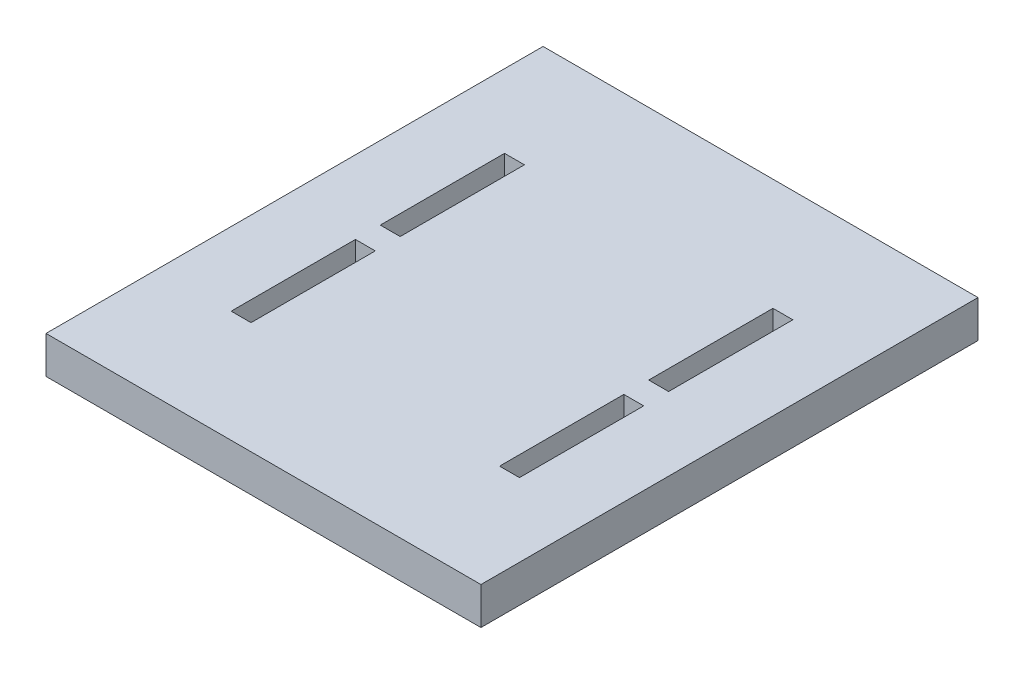
ISO-10303-21;
HEADER;
FILE_DESCRIPTION(('STEP AP214'),'2;1');
FILE_NAME('part.step','',(''),(''),'','','');
FILE_SCHEMA(('AUTOMOTIVE_DESIGN { 1 0 10303 214 1 1 1 1 }'));
ENDSEC;
DATA;
#1=APPLICATION_CONTEXT('core data for automotive mechanical design processes');
#2=APPLICATION_PROTOCOL_DEFINITION('international standard','automotive_design',2000,#1);
#3=PRODUCT_CONTEXT('',#1,'mechanical');
#4=PRODUCT('Part','Part','',(#3));
#5=PRODUCT_RELATED_PRODUCT_CATEGORY('part','',(#4));
#6=PRODUCT_DEFINITION_FORMATION('','',#4);
#7=PRODUCT_DEFINITION_CONTEXT('part definition',#1,'design');
#8=PRODUCT_DEFINITION('design','',#6,#7);
#9=PRODUCT_DEFINITION_SHAPE('','',#8);
#10=(LENGTH_UNIT() NAMED_UNIT(*) SI_UNIT(.MILLI.,.METRE.));
#11=(NAMED_UNIT(*) PLANE_ANGLE_UNIT() SI_UNIT($,.RADIAN.));
#12=(NAMED_UNIT(*) SI_UNIT($,.STERADIAN.) SOLID_ANGLE_UNIT());
#13=UNCERTAINTY_MEASURE_WITH_UNIT(LENGTH_MEASURE(1.E-05),#10,'distance_accuracy_value','');
#14=(GEOMETRIC_REPRESENTATION_CONTEXT(3) GLOBAL_UNCERTAINTY_ASSIGNED_CONTEXT((#13)) GLOBAL_UNIT_ASSIGNED_CONTEXT((#10,
#11,#12)) REPRESENTATION_CONTEXT('',''));
#15=CARTESIAN_POINT('',(0.,0.,0.));
#16=DIRECTION('',(0.,0.,1.));
#17=DIRECTION('',(1.,0.,0.));
#18=AXIS2_PLACEMENT_3D('',#15,#16,#17);
#19=CARTESIAN_POINT('',(0.,6.,42.));
#20=DIRECTION('',(0.,0.,1.));
#21=DIRECTION('',(1.,0.,0.));
#22=AXIS2_PLACEMENT_3D('',#19,#20,#21);
#23=PLANE('',#22);
#24=DIRECTION('',(-1.,0.,0.));
#25=VECTOR('',#24,1.);
#26=CARTESIAN_POINT('',(0.,0.,42.));
#27=LINE('',#26,#25);
#28=CARTESIAN_POINT('',(58.2,0.,42.));
#29=VERTEX_POINT('',#28);
#30=CARTESIAN_POINT('',(55.,0.,42.));
#31=VERTEX_POINT('',#30);
#32=EDGE_CURVE('E289',#29,#31,#27,.T.);
#33=ORIENTED_EDGE('',*,*,#32,.F.);
#34=DIRECTION('',(0.,-1.,0.));
#35=VECTOR('',#34,1.);
#36=CARTESIAN_POINT('',(58.2,6.,42.));
#37=LINE('',#36,#35);
#38=CARTESIAN_POINT('',(58.2,6.,42.));
#39=VERTEX_POINT('',#38);
#40=EDGE_CURVE('E11',#39,#29,#37,.T.);
#41=ORIENTED_EDGE('',*,*,#40,.F.);
#42=DIRECTION('',(-1.,0.,0.));
#43=VECTOR('',#42,1.);
#44=CARTESIAN_POINT('',(0.,6.,42.));
#45=LINE('',#44,#43);
#46=CARTESIAN_POINT('',(55.,6.,42.));
#47=VERTEX_POINT('',#46);
#48=EDGE_CURVE('E215',#39,#47,#45,.T.);
#49=ORIENTED_EDGE('',*,*,#48,.T.);
#50=DIRECTION('',(0.,-1.,0.));
#51=VECTOR('',#50,1.);
#52=CARTESIAN_POINT('',(55.,6.,42.));
#53=LINE('',#52,#51);
#54=EDGE_CURVE('E138',#47,#31,#53,.T.);
#55=ORIENTED_EDGE('',*,*,#54,.T.);
#56=EDGE_LOOP('',(#33,#41,#49,#55));
#57=FACE_BOUND('',#56,.T.);
#58=ADVANCED_FACE('F47',(#57),#23,.T.);
#59=CARTESIAN_POINT('',(58.2,6.,0.));
#60=DIRECTION('',(-1.,0.,0.));
#61=DIRECTION('',(0.,0.,1.));
#62=AXIS2_PLACEMENT_3D('',#59,#60,#61);
#63=PLANE('',#62);
#64=DIRECTION('',(0.,0.,-1.));
#65=VECTOR('',#64,1.);
#66=CARTESIAN_POINT('',(58.2,0.,0.));
#67=LINE('',#66,#65);
#68=CARTESIAN_POINT('',(58.2,0.,62.));
#69=VERTEX_POINT('',#68);
#70=EDGE_CURVE('E203',#69,#29,#67,.T.);
#71=ORIENTED_EDGE('',*,*,#70,.F.);
#72=DIRECTION('',(0.,-1.,0.));
#73=VECTOR('',#72,1.);
#74=CARTESIAN_POINT('',(58.2,6.,62.));
#75=LINE('',#74,#73);
#76=CARTESIAN_POINT('',(58.2,6.,62.));
#77=VERTEX_POINT('',#76);
#78=EDGE_CURVE('E58',#77,#69,#75,.T.);
#79=ORIENTED_EDGE('',*,*,#78,.F.);
#80=DIRECTION('',(0.,0.,-1.));
#81=VECTOR('',#80,1.);
#82=CARTESIAN_POINT('',(58.2,6.,0.));
#83=LINE('',#82,#81);
#84=EDGE_CURVE('E201',#77,#39,#83,.T.);
#85=ORIENTED_EDGE('',*,*,#84,.T.);
#86=ORIENTED_EDGE('',*,*,#40,.T.);
#87=EDGE_LOOP('',(#71,#79,#85,#86));
#88=FACE_BOUND('',#87,.T.);
#89=ADVANCED_FACE('F199',(#88),#63,.T.);
#90=CARTESIAN_POINT('',(0.,6.,62.));
#91=DIRECTION('',(0.,0.,1.));
#92=DIRECTION('',(1.,0.,0.));
#93=AXIS2_PLACEMENT_3D('',#90,#91,#92);
#94=PLANE('',#93);
#95=DIRECTION('',(-1.,0.,0.));
#96=VECTOR('',#95,1.);
#97=CARTESIAN_POINT('',(0.,0.,62.));
#98=LINE('',#97,#96);
#99=CARTESIAN_POINT('',(55.,0.,62.));
#100=VERTEX_POINT('',#99);
#101=EDGE_CURVE('E294',#69,#100,#98,.T.);
#102=ORIENTED_EDGE('',*,*,#101,.T.);
#103=DIRECTION('',(0.,-1.,0.));
#104=VECTOR('',#103,1.);
#105=CARTESIAN_POINT('',(55.,6.,62.));
#106=LINE('',#105,#104);
#107=CARTESIAN_POINT('',(55.,6.,62.));
#108=VERTEX_POINT('',#107);
#109=EDGE_CURVE('E207',#108,#100,#106,.T.);
#110=ORIENTED_EDGE('',*,*,#109,.F.);
#111=DIRECTION('',(-1.,0.,0.));
#112=VECTOR('',#111,1.);
#113=CARTESIAN_POINT('',(0.,6.,62.));
#114=LINE('',#113,#112);
#115=EDGE_CURVE('E210',#77,#108,#114,.T.);
#116=ORIENTED_EDGE('',*,*,#115,.F.);
#117=ORIENTED_EDGE('',*,*,#78,.T.);
#118=EDGE_LOOP('',(#102,#110,#116,#117));
#119=FACE_BOUND('',#118,.T.);
#120=ADVANCED_FACE('F211',(#119),#94,.F.);
#121=CARTESIAN_POINT('',(0.,6.,62.));
#122=DIRECTION('',(0.,0.,-1.));
#123=DIRECTION('',(-1.,0.,0.));
#124=AXIS2_PLACEMENT_3D('',#121,#122,#123);
#125=PLANE('',#124);
#126=DIRECTION('',(1.,0.,0.));
#127=VECTOR('',#126,1.);
#128=CARTESIAN_POINT('',(0.,0.,62.));
#129=LINE('',#128,#127);
#130=CARTESIAN_POINT('',(11.8,0.,62.));
#131=VERTEX_POINT('',#130);
#132=CARTESIAN_POINT('',(15.,0.,62.));
#133=VERTEX_POINT('',#132);
#134=EDGE_CURVE('E273',#131,#133,#129,.T.);
#135=ORIENTED_EDGE('',*,*,#134,.F.);
#136=DIRECTION('',(0.,-1.,0.));
#137=VECTOR('',#136,1.);
#138=CARTESIAN_POINT('',(11.8,6.,62.));
#139=LINE('',#138,#137);
#140=CARTESIAN_POINT('',(11.8,6.,62.));
#141=VERTEX_POINT('',#140);
#142=EDGE_CURVE('E301',#141,#131,#139,.T.);
#143=ORIENTED_EDGE('',*,*,#142,.F.);
#144=DIRECTION('',(1.,0.,0.));
#145=VECTOR('',#144,1.);
#146=CARTESIAN_POINT('',(0.,6.,62.));
#147=LINE('',#146,#145);
#148=CARTESIAN_POINT('',(15.,6.,62.));
#149=VERTEX_POINT('',#148);
#150=EDGE_CURVE('E411',#141,#149,#147,.T.);
#151=ORIENTED_EDGE('',*,*,#150,.T.);
#152=DIRECTION('',(0.,-1.,0.));
#153=VECTOR('',#152,1.);
#154=CARTESIAN_POINT('',(15.,6.,62.));
#155=LINE('',#154,#153);
#156=EDGE_CURVE('E304',#149,#133,#155,.T.);
#157=ORIENTED_EDGE('',*,*,#156,.T.);
#158=EDGE_LOOP('',(#135,#143,#151,#157));
#159=FACE_BOUND('',#158,.T.);
#160=ADVANCED_FACE('F438',(#159),#125,.T.);
#161=CARTESIAN_POINT('',(11.8,6.,0.));
#162=DIRECTION('',(-1.,0.,0.));
#163=DIRECTION('',(0.,0.,1.));
#164=AXIS2_PLACEMENT_3D('',#161,#162,#163);
#165=PLANE('',#164);
#166=DIRECTION('',(0.,0.,-1.));
#167=VECTOR('',#166,1.);
#168=CARTESIAN_POINT('',(11.8,0.,0.));
#169=LINE('',#168,#167);
#170=CARTESIAN_POINT('',(11.8,0.,42.));
#171=VERTEX_POINT('',#170);
#172=EDGE_CURVE('E277',#131,#171,#169,.T.);
#173=ORIENTED_EDGE('',*,*,#172,.T.);
#174=DIRECTION('',(0.,-1.,0.));
#175=VECTOR('',#174,1.);
#176=CARTESIAN_POINT('',(11.8,6.,42.));
#177=LINE('',#176,#175);
#178=CARTESIAN_POINT('',(11.8,6.,42.));
#179=VERTEX_POINT('',#178);
#180=EDGE_CURVE('E311',#179,#171,#177,.T.);
#181=ORIENTED_EDGE('',*,*,#180,.F.);
#182=DIRECTION('',(0.,0.,-1.));
#183=VECTOR('',#182,1.);
#184=CARTESIAN_POINT('',(11.8,6.,0.));
#185=LINE('',#184,#183);
#186=EDGE_CURVE('E415',#141,#179,#185,.T.);
#187=ORIENTED_EDGE('',*,*,#186,.F.);
#188=ORIENTED_EDGE('',*,*,#142,.T.);
#189=EDGE_LOOP('',(#173,#181,#187,#188));
#190=FACE_BOUND('',#189,.T.);
#191=ADVANCED_FACE('F440',(#190),#165,.F.);
#192=CARTESIAN_POINT('',(0.,6.,42.));
#193=DIRECTION('',(0.,0.,-1.));
#194=DIRECTION('',(-1.,0.,0.));
#195=AXIS2_PLACEMENT_3D('',#192,#193,#194);
#196=PLANE('',#195);
#197=DIRECTION('',(1.,0.,0.));
#198=VECTOR('',#197,1.);
#199=CARTESIAN_POINT('',(0.,0.,42.));
#200=LINE('',#199,#198);
#201=CARTESIAN_POINT('',(15.,0.,42.));
#202=VERTEX_POINT('',#201);
#203=EDGE_CURVE('E281',#171,#202,#200,.T.);
#204=ORIENTED_EDGE('',*,*,#203,.T.);
#205=DIRECTION('',(0.,-1.,0.));
#206=VECTOR('',#205,1.);
#207=CARTESIAN_POINT('',(15.,6.,42.));
#208=LINE('',#207,#206);
#209=CARTESIAN_POINT('',(15.,6.,42.));
#210=VERTEX_POINT('',#209);
#211=EDGE_CURVE('E307',#210,#202,#208,.T.);
#212=ORIENTED_EDGE('',*,*,#211,.F.);
#213=DIRECTION('',(1.,0.,0.));
#214=VECTOR('',#213,1.);
#215=CARTESIAN_POINT('',(0.,6.,42.));
#216=LINE('',#215,#214);
#217=EDGE_CURVE('E419',#179,#210,#216,.T.);
#218=ORIENTED_EDGE('',*,*,#217,.F.);
#219=ORIENTED_EDGE('',*,*,#180,.T.);
#220=EDGE_LOOP('',(#204,#212,#218,#219));
#221=FACE_BOUND('',#220,.T.);
#222=ADVANCED_FACE('F433',(#221),#196,.F.);
#223=CARTESIAN_POINT('',(0.,6.,18.));
#224=DIRECTION('',(0.,0.,1.));
#225=DIRECTION('',(1.,0.,0.));
#226=AXIS2_PLACEMENT_3D('',#223,#224,#225);
#227=PLANE('',#226);
#228=DIRECTION('',(-1.,0.,0.));
#229=VECTOR('',#228,1.);
#230=CARTESIAN_POINT('',(0.,0.,18.));
#231=LINE('',#230,#229);
#232=CARTESIAN_POINT('',(58.2,0.,18.));
#233=VERTEX_POINT('',#232);
#234=CARTESIAN_POINT('',(55.,0.,18.));
#235=VERTEX_POINT('',#234);
#236=EDGE_CURVE('E257',#233,#235,#231,.T.);
#237=ORIENTED_EDGE('',*,*,#236,.F.);
#238=DIRECTION('',(0.,-1.,0.));
#239=VECTOR('',#238,1.);
#240=CARTESIAN_POINT('',(58.2,6.,18.));
#241=LINE('',#240,#239);
#242=CARTESIAN_POINT('',(58.2,6.,18.));
#243=VERTEX_POINT('',#242);
#244=EDGE_CURVE('E308',#243,#233,#241,.T.);
#245=ORIENTED_EDGE('',*,*,#244,.F.);
#246=DIRECTION('',(-1.,0.,0.));
#247=VECTOR('',#246,1.);
#248=CARTESIAN_POINT('',(0.,6.,18.));
#249=LINE('',#248,#247);
#250=CARTESIAN_POINT('',(55.,6.,18.));
#251=VERTEX_POINT('',#250);
#252=EDGE_CURVE('E396',#243,#251,#249,.T.);
#253=ORIENTED_EDGE('',*,*,#252,.T.);
#254=DIRECTION('',(0.,-1.,0.));
#255=VECTOR('',#254,1.);
#256=CARTESIAN_POINT('',(55.,6.,18.));
#257=LINE('',#256,#255);
#258=EDGE_CURVE('E317',#251,#235,#257,.T.);
#259=ORIENTED_EDGE('',*,*,#258,.T.);
#260=EDGE_LOOP('',(#237,#245,#253,#259));
#261=FACE_BOUND('',#260,.T.);
#262=ADVANCED_FACE('F447',(#261),#227,.T.);
#263=CARTESIAN_POINT('',(58.2,6.,0.));
#264=DIRECTION('',(1.,0.,0.));
#265=DIRECTION('',(0.,0.,-1.));
#266=AXIS2_PLACEMENT_3D('',#263,#264,#265);
#267=PLANE('',#266);
#268=DIRECTION('',(0.,0.,1.));
#269=VECTOR('',#268,1.);
#270=CARTESIAN_POINT('',(58.2,0.,0.));
#271=LINE('',#270,#269);
#272=CARTESIAN_POINT('',(58.2,0.,38.));
#273=VERTEX_POINT('',#272);
#274=EDGE_CURVE('E261',#233,#273,#271,.T.);
#275=ORIENTED_EDGE('',*,*,#274,.T.);
#276=DIRECTION('',(0.,-1.,0.));
#277=VECTOR('',#276,1.);
#278=CARTESIAN_POINT('',(58.2,6.,38.));
#279=LINE('',#278,#277);
#280=CARTESIAN_POINT('',(58.2,6.,38.));
#281=VERTEX_POINT('',#280);
#282=EDGE_CURVE('E324',#281,#273,#279,.T.);
#283=ORIENTED_EDGE('',*,*,#282,.F.);
#284=DIRECTION('',(0.,0.,1.));
#285=VECTOR('',#284,1.);
#286=CARTESIAN_POINT('',(58.2,6.,0.));
#287=LINE('',#286,#285);
#288=EDGE_CURVE('E400',#243,#281,#287,.T.);
#289=ORIENTED_EDGE('',*,*,#288,.F.);
#290=ORIENTED_EDGE('',*,*,#244,.T.);
#291=EDGE_LOOP('',(#275,#283,#289,#290));
#292=FACE_BOUND('',#291,.T.);
#293=ADVANCED_FACE('F493',(#292),#267,.F.);
#294=CARTESIAN_POINT('',(0.,6.,38.));
#295=DIRECTION('',(0.,0.,1.));
#296=DIRECTION('',(1.,0.,0.));
#297=AXIS2_PLACEMENT_3D('',#294,#295,#296);
#298=PLANE('',#297);
#299=DIRECTION('',(-1.,0.,0.));
#300=VECTOR('',#299,1.);
#301=CARTESIAN_POINT('',(0.,0.,38.));
#302=LINE('',#301,#300);
#303=CARTESIAN_POINT('',(55.,0.,38.));
#304=VERTEX_POINT('',#303);
#305=EDGE_CURVE('E265',#273,#304,#302,.T.);
#306=ORIENTED_EDGE('',*,*,#305,.T.);
#307=DIRECTION('',(0.,-1.,0.));
#308=VECTOR('',#307,1.);
#309=CARTESIAN_POINT('',(55.,6.,38.));
#310=LINE('',#309,#308);
#311=CARTESIAN_POINT('',(55.,6.,38.));
#312=VERTEX_POINT('',#311);
#313=EDGE_CURVE('E320',#312,#304,#310,.T.);
#314=ORIENTED_EDGE('',*,*,#313,.F.);
#315=DIRECTION('',(-1.,0.,0.));
#316=VECTOR('',#315,1.);
#317=CARTESIAN_POINT('',(0.,6.,38.));
#318=LINE('',#317,#316);
#319=EDGE_CURVE('E404',#281,#312,#318,.T.);
#320=ORIENTED_EDGE('',*,*,#319,.F.);
#321=ORIENTED_EDGE('',*,*,#282,.T.);
#322=EDGE_LOOP('',(#306,#314,#320,#321));
#323=FACE_BOUND('',#322,.T.);
#324=ADVANCED_FACE('F479',(#323),#298,.F.);
#325=CARTESIAN_POINT('',(0.,6.,18.));
#326=DIRECTION('',(0.,0.,-1.));
#327=DIRECTION('',(-1.,0.,0.));
#328=AXIS2_PLACEMENT_3D('',#325,#326,#327);
#329=PLANE('',#328);
#330=DIRECTION('',(1.,0.,0.));
#331=VECTOR('',#330,1.);
#332=CARTESIAN_POINT('',(0.,0.,18.));
#333=LINE('',#332,#331);
#334=CARTESIAN_POINT('',(11.8,0.,18.));
#335=VERTEX_POINT('',#334);
#336=CARTESIAN_POINT('',(15.,0.,18.));
#337=VERTEX_POINT('',#336);
#338=EDGE_CURVE('E241',#335,#337,#333,.T.);
#339=ORIENTED_EDGE('',*,*,#338,.T.);
#340=DIRECTION('',(0.,-1.,0.));
#341=VECTOR('',#340,1.);
#342=CARTESIAN_POINT('',(15.,6.,18.));
#343=LINE('',#342,#341);
#344=CARTESIAN_POINT('',(15.,6.,18.));
#345=VERTEX_POINT('',#344);
#346=EDGE_CURVE('E321',#345,#337,#343,.T.);
#347=ORIENTED_EDGE('',*,*,#346,.F.);
#348=DIRECTION('',(1.,0.,0.));
#349=VECTOR('',#348,1.);
#350=CARTESIAN_POINT('',(0.,6.,18.));
#351=LINE('',#350,#349);
#352=CARTESIAN_POINT('',(11.8,6.,18.));
#353=VERTEX_POINT('',#352);
#354=EDGE_CURVE('E373',#353,#345,#351,.T.);
#355=ORIENTED_EDGE('',*,*,#354,.F.);
#356=DIRECTION('',(0.,-1.,0.));
#357=VECTOR('',#356,1.);
#358=CARTESIAN_POINT('',(11.8,6.,18.));
#359=LINE('',#358,#357);
#360=EDGE_CURVE('E330',#353,#335,#359,.T.);
#361=ORIENTED_EDGE('',*,*,#360,.T.);
#362=EDGE_LOOP('',(#339,#347,#355,#361));
#363=FACE_BOUND('',#362,.T.);
#364=ADVANCED_FACE('F475',(#363),#329,.F.);
#365=CARTESIAN_POINT('',(15.,6.,0.));
#366=DIRECTION('',(1.,0.,0.));
#367=DIRECTION('',(0.,0.,-1.));
#368=AXIS2_PLACEMENT_3D('',#365,#366,#367);
#369=PLANE('',#368);
#370=DIRECTION('',(0.,0.,1.));
#371=VECTOR('',#370,1.);
#372=CARTESIAN_POINT('',(15.,0.,0.));
#373=LINE('',#372,#371);
#374=CARTESIAN_POINT('',(15.,0.,38.));
#375=VERTEX_POINT('',#374);
#376=EDGE_CURVE('E245',#337,#375,#373,.T.);
#377=ORIENTED_EDGE('',*,*,#376,.T.);
#378=DIRECTION('',(0.,-1.,0.));
#379=VECTOR('',#378,1.);
#380=CARTESIAN_POINT('',(15.,6.,38.));
#381=LINE('',#380,#379);
#382=CARTESIAN_POINT('',(15.,6.,38.));
#383=VERTEX_POINT('',#382);
#384=EDGE_CURVE('E336',#383,#375,#381,.T.);
#385=ORIENTED_EDGE('',*,*,#384,.F.);
#386=DIRECTION('',(0.,0.,1.));
#387=VECTOR('',#386,1.);
#388=CARTESIAN_POINT('',(15.,6.,0.));
#389=LINE('',#388,#387);
#390=EDGE_CURVE('E385',#345,#383,#389,.T.);
#391=ORIENTED_EDGE('',*,*,#390,.F.);
#392=ORIENTED_EDGE('',*,*,#346,.T.);
#393=EDGE_LOOP('',(#377,#385,#391,#392));
#394=FACE_BOUND('',#393,.T.);
#395=ADVANCED_FACE('F478',(#394),#369,.F.);
#396=CARTESIAN_POINT('',(0.,6.,38.));
#397=DIRECTION('',(0.,0.,-1.));
#398=DIRECTION('',(-1.,0.,0.));
#399=AXIS2_PLACEMENT_3D('',#396,#397,#398);
#400=PLANE('',#399);
#401=DIRECTION('',(1.,0.,0.));
#402=VECTOR('',#401,1.);
#403=CARTESIAN_POINT('',(0.,0.,38.));
#404=LINE('',#403,#402);
#405=CARTESIAN_POINT('',(11.8,0.,38.));
#406=VERTEX_POINT('',#405);
#407=EDGE_CURVE('E249',#406,#375,#404,.T.);
#408=ORIENTED_EDGE('',*,*,#407,.F.);
#409=DIRECTION('',(0.,-1.,0.));
#410=VECTOR('',#409,1.);
#411=CARTESIAN_POINT('',(11.8,6.,38.));
#412=LINE('',#411,#410);
#413=CARTESIAN_POINT('',(11.8,6.,38.));
#414=VERTEX_POINT('',#413);
#415=EDGE_CURVE('E333',#414,#406,#412,.T.);
#416=ORIENTED_EDGE('',*,*,#415,.F.);
#417=DIRECTION('',(1.,0.,0.));
#418=VECTOR('',#417,1.);
#419=CARTESIAN_POINT('',(0.,6.,38.));
#420=LINE('',#419,#418);
#421=EDGE_CURVE('E388',#414,#383,#420,.T.);
#422=ORIENTED_EDGE('',*,*,#421,.T.);
#423=ORIENTED_EDGE('',*,*,#384,.T.);
#424=EDGE_LOOP('',(#408,#416,#422,#423));
#425=FACE_BOUND('',#424,.T.);
#426=ADVANCED_FACE('F483',(#425),#400,.T.);
#427=CARTESIAN_POINT('',(0.,6.,80.));
#428=DIRECTION('',(0.,0.,-1.));
#429=DIRECTION('',(-1.,0.,0.));
#430=AXIS2_PLACEMENT_3D('',#427,#428,#429);
#431=PLANE('',#430);
#432=DIRECTION('',(1.,0.,0.));
#433=VECTOR('',#432,1.);
#434=CARTESIAN_POINT('',(0.,0.,80.));
#435=LINE('',#434,#433);
#436=CARTESIAN_POINT('',(0.,0.,80.));
#437=VERTEX_POINT('',#436);
#438=CARTESIAN_POINT('',(70.,0.,80.));
#439=VERTEX_POINT('',#438);
#440=EDGE_CURVE('E226',#437,#439,#435,.T.);
#441=ORIENTED_EDGE('',*,*,#440,.T.);
#442=DIRECTION('',(0.,-1.,0.));
#443=VECTOR('',#442,1.);
#444=CARTESIAN_POINT('',(70.,6.,80.));
#445=LINE('',#444,#443);
#446=CARTESIAN_POINT('',(70.,6.,80.));
#447=VERTEX_POINT('',#446);
#448=EDGE_CURVE('E51',#447,#439,#445,.T.);
#449=ORIENTED_EDGE('',*,*,#448,.F.);
#450=DIRECTION('',(1.,0.,0.));
#451=VECTOR('',#450,1.);
#452=CARTESIAN_POINT('',(0.,6.,80.));
#453=LINE('',#452,#451);
#454=CARTESIAN_POINT('',(0.,6.,80.));
#455=VERTEX_POINT('',#454);
#456=EDGE_CURVE('E146',#455,#447,#453,.T.);
#457=ORIENTED_EDGE('',*,*,#456,.F.);
#458=DIRECTION('',(0.,-1.,0.));
#459=VECTOR('',#458,1.);
#460=CARTESIAN_POINT('',(0.,6.,80.));
#461=LINE('',#460,#459);
#462=EDGE_CURVE('E225',#455,#437,#461,.T.);
#463=ORIENTED_EDGE('',*,*,#462,.T.);
#464=EDGE_LOOP('',(#441,#449,#457,#463));
#465=FACE_BOUND('',#464,.T.);
#466=ADVANCED_FACE('F49',(#465),#431,.F.);
#467=CARTESIAN_POINT('',(70.,6.,0.));
#468=DIRECTION('',(1.,0.,0.));
#469=DIRECTION('',(0.,0.,-1.));
#470=AXIS2_PLACEMENT_3D('',#467,#468,#469);
#471=PLANE('',#470);
#472=DIRECTION('',(0.,0.,1.));
#473=VECTOR('',#472,1.);
#474=CARTESIAN_POINT('',(70.,0.,0.));
#475=LINE('',#474,#473);
#476=CARTESIAN_POINT('',(70.,0.,0.));
#477=VERTEX_POINT('',#476);
#478=EDGE_CURVE('E230',#477,#439,#475,.T.);
#479=ORIENTED_EDGE('',*,*,#478,.F.);
#480=DIRECTION('',(0.,-1.,0.));
#481=VECTOR('',#480,1.);
#482=CARTESIAN_POINT('',(70.,6.,0.));
#483=LINE('',#482,#481);
#484=CARTESIAN_POINT('',(70.,6.,0.));
#485=VERTEX_POINT('',#484);
#486=EDGE_CURVE('E347',#485,#477,#483,.T.);
#487=ORIENTED_EDGE('',*,*,#486,.F.);
#488=DIRECTION('',(0.,0.,1.));
#489=VECTOR('',#488,1.);
#490=CARTESIAN_POINT('',(70.,6.,0.));
#491=LINE('',#490,#489);
#492=EDGE_CURVE('E357',#485,#447,#491,.T.);
#493=ORIENTED_EDGE('',*,*,#492,.T.);
#494=ORIENTED_EDGE('',*,*,#448,.T.);
#495=EDGE_LOOP('',(#479,#487,#493,#494));
#496=FACE_BOUND('',#495,.T.);
#497=ADVANCED_FACE('F356',(#496),#471,.T.);
#498=CARTESIAN_POINT('',(0.,6.,0.));
#499=DIRECTION('',(0.,0.,-1.));
#500=DIRECTION('',(-1.,0.,0.));
#501=AXIS2_PLACEMENT_3D('',#498,#499,#500);
#502=PLANE('',#501);
#503=DIRECTION('',(1.,0.,0.));
#504=VECTOR('',#503,1.);
#505=CARTESIAN_POINT('',(0.,0.,0.));
#506=LINE('',#505,#504);
#507=CARTESIAN_POINT('',(0.,0.,0.));
#508=VERTEX_POINT('',#507);
#509=EDGE_CURVE('E234',#508,#477,#506,.T.);
#510=ORIENTED_EDGE('',*,*,#509,.F.);
#511=DIRECTION('',(0.,-1.,0.));
#512=VECTOR('',#511,1.);
#513=CARTESIAN_POINT('',(0.,6.,0.));
#514=LINE('',#513,#512);
#515=CARTESIAN_POINT('',(0.,6.,0.));
#516=VERTEX_POINT('',#515);
#517=EDGE_CURVE('E345',#516,#508,#514,.T.);
#518=ORIENTED_EDGE('',*,*,#517,.F.);
#519=DIRECTION('',(1.,0.,0.));
#520=VECTOR('',#519,1.);
#521=CARTESIAN_POINT('',(0.,6.,0.));
#522=LINE('',#521,#520);
#523=EDGE_CURVE('E368',#516,#485,#522,.T.);
#524=ORIENTED_EDGE('',*,*,#523,.T.);
#525=ORIENTED_EDGE('',*,*,#486,.T.);
#526=EDGE_LOOP('',(#510,#518,#524,#525));
#527=FACE_BOUND('',#526,.T.);
#528=ADVANCED_FACE('F365',(#527),#502,.T.);
#529=CARTESIAN_POINT('',(15.,6.,0.));
#530=DIRECTION('',(-1.,0.,0.));
#531=DIRECTION('',(0.,0.,1.));
#532=AXIS2_PLACEMENT_3D('',#529,#530,#531);
#533=PLANE('',#532);
#534=DIRECTION('',(0.,0.,-1.));
#535=VECTOR('',#534,1.);
#536=CARTESIAN_POINT('',(15.,0.,0.));
#537=LINE('',#536,#535);
#538=EDGE_CURVE('E285',#133,#202,#537,.T.);
#539=ORIENTED_EDGE('',*,*,#538,.F.);
#540=ORIENTED_EDGE('',*,*,#156,.F.);
#541=DIRECTION('',(0.,0.,-1.));
#542=VECTOR('',#541,1.);
#543=CARTESIAN_POINT('',(15.,6.,0.));
#544=LINE('',#543,#542);
#545=EDGE_CURVE('E219',#149,#210,#544,.T.);
#546=ORIENTED_EDGE('',*,*,#545,.T.);
#547=ORIENTED_EDGE('',*,*,#211,.T.);
#548=EDGE_LOOP('',(#539,#540,#546,#547));
#549=FACE_BOUND('',#548,.T.);
#550=ADVANCED_FACE('F426',(#549),#533,.T.);
#551=CARTESIAN_POINT('',(55.,6.,0.));
#552=DIRECTION('',(1.,0.,0.));
#553=DIRECTION('',(0.,0.,-1.));
#554=AXIS2_PLACEMENT_3D('',#551,#552,#553);
#555=PLANE('',#554);
#556=DIRECTION('',(0.,0.,1.));
#557=VECTOR('',#556,1.);
#558=CARTESIAN_POINT('',(55.,0.,0.));
#559=LINE('',#558,#557);
#560=EDGE_CURVE('E269',#235,#304,#559,.T.);
#561=ORIENTED_EDGE('',*,*,#560,.F.);
#562=ORIENTED_EDGE('',*,*,#258,.F.);
#563=DIRECTION('',(0.,0.,1.));
#564=VECTOR('',#563,1.);
#565=CARTESIAN_POINT('',(55.,6.,0.));
#566=LINE('',#565,#564);
#567=EDGE_CURVE('E407',#251,#312,#566,.T.);
#568=ORIENTED_EDGE('',*,*,#567,.T.);
#569=ORIENTED_EDGE('',*,*,#313,.T.);
#570=EDGE_LOOP('',(#561,#562,#568,#569));
#571=FACE_BOUND('',#570,.T.);
#572=ADVANCED_FACE('F459',(#571),#555,.T.);
#573=CARTESIAN_POINT('',(11.8,6.,0.));
#574=DIRECTION('',(1.,0.,0.));
#575=DIRECTION('',(0.,0.,-1.));
#576=AXIS2_PLACEMENT_3D('',#573,#574,#575);
#577=PLANE('',#576);
#578=DIRECTION('',(0.,0.,1.));
#579=VECTOR('',#578,1.);
#580=CARTESIAN_POINT('',(11.8,0.,0.));
#581=LINE('',#580,#579);
#582=EDGE_CURVE('E253',#335,#406,#581,.T.);
#583=ORIENTED_EDGE('',*,*,#582,.F.);
#584=ORIENTED_EDGE('',*,*,#360,.F.);
#585=DIRECTION('',(0.,0.,1.));
#586=VECTOR('',#585,1.);
#587=CARTESIAN_POINT('',(11.8,6.,0.));
#588=LINE('',#587,#586);
#589=EDGE_CURVE('E392',#353,#414,#588,.T.);
#590=ORIENTED_EDGE('',*,*,#589,.T.);
#591=ORIENTED_EDGE('',*,*,#415,.T.);
#592=EDGE_LOOP('',(#583,#584,#590,#591));
#593=FACE_BOUND('',#592,.T.);
#594=ADVANCED_FACE('F464',(#593),#577,.T.);
#595=CARTESIAN_POINT('',(0.,6.,0.));
#596=DIRECTION('',(1.,0.,0.));
#597=DIRECTION('',(0.,0.,-1.));
#598=AXIS2_PLACEMENT_3D('',#595,#596,#597);
#599=PLANE('',#598);
#600=DIRECTION('',(0.,0.,1.));
#601=VECTOR('',#600,1.);
#602=CARTESIAN_POINT('',(0.,0.,0.));
#603=LINE('',#602,#601);
#604=EDGE_CURVE('E238',#508,#437,#603,.T.);
#605=ORIENTED_EDGE('',*,*,#604,.T.);
#606=ORIENTED_EDGE('',*,*,#462,.F.);
#607=DIRECTION('',(0.,0.,1.));
#608=VECTOR('',#607,1.);
#609=CARTESIAN_POINT('',(0.,6.,0.));
#610=LINE('',#609,#608);
#611=EDGE_CURVE('E370',#516,#455,#610,.T.);
#612=ORIENTED_EDGE('',*,*,#611,.F.);
#613=ORIENTED_EDGE('',*,*,#517,.T.);
#614=EDGE_LOOP('',(#605,#606,#612,#613));
#615=FACE_BOUND('',#614,.T.);
#616=ADVANCED_FACE('F371',(#615),#599,.F.);
#617=CARTESIAN_POINT('',(55.,6.,0.));
#618=DIRECTION('',(-1.,0.,0.));
#619=DIRECTION('',(0.,0.,1.));
#620=AXIS2_PLACEMENT_3D('',#617,#618,#619);
#621=PLANE('',#620);
#622=DIRECTION('',(0.,0.,-1.));
#623=VECTOR('',#622,1.);
#624=CARTESIAN_POINT('',(55.,0.,0.));
#625=LINE('',#624,#623);
#626=EDGE_CURVE('E131',#100,#31,#625,.T.);
#627=ORIENTED_EDGE('',*,*,#626,.T.);
#628=ORIENTED_EDGE('',*,*,#54,.F.);
#629=DIRECTION('',(0.,0.,-1.));
#630=VECTOR('',#629,1.);
#631=CARTESIAN_POINT('',(55.,6.,0.));
#632=LINE('',#631,#630);
#633=EDGE_CURVE('E67',#108,#47,#632,.T.);
#634=ORIENTED_EDGE('',*,*,#633,.F.);
#635=ORIENTED_EDGE('',*,*,#109,.T.);
#636=EDGE_LOOP('',(#627,#628,#634,#635));
#637=FACE_BOUND('',#636,.T.);
#638=ADVANCED_FACE('F474',(#637),#621,.F.);
#639=CARTESIAN_POINT('',(0.,6.,0.));
#640=DIRECTION('',(0.,1.,0.));
#641=DIRECTION('',(0.,0.,1.));
#642=AXIS2_PLACEMENT_3D('',#639,#640,#641);
#643=PLANE('',#642);
#644=ORIENTED_EDGE('',*,*,#456,.T.);
#645=ORIENTED_EDGE('',*,*,#492,.F.);
#646=ORIENTED_EDGE('',*,*,#523,.F.);
#647=ORIENTED_EDGE('',*,*,#611,.T.);
#648=EDGE_LOOP('',(#644,#645,#646,#647));
#649=FACE_BOUND('',#648,.T.);
#650=ORIENTED_EDGE('',*,*,#354,.T.);
#651=ORIENTED_EDGE('',*,*,#390,.T.);
#652=ORIENTED_EDGE('',*,*,#421,.F.);
#653=ORIENTED_EDGE('',*,*,#589,.F.);
#654=EDGE_LOOP('',(#650,#651,#652,#653));
#655=FACE_BOUND('',#654,.T.);
#656=ORIENTED_EDGE('',*,*,#252,.F.);
#657=ORIENTED_EDGE('',*,*,#288,.T.);
#658=ORIENTED_EDGE('',*,*,#319,.T.);
#659=ORIENTED_EDGE('',*,*,#567,.F.);
#660=EDGE_LOOP('',(#656,#657,#658,#659));
#661=FACE_BOUND('',#660,.T.);
#662=ORIENTED_EDGE('',*,*,#150,.F.);
#663=ORIENTED_EDGE('',*,*,#186,.T.);
#664=ORIENTED_EDGE('',*,*,#217,.T.);
#665=ORIENTED_EDGE('',*,*,#545,.F.);
#666=EDGE_LOOP('',(#662,#663,#664,#665));
#667=FACE_BOUND('',#666,.T.);
#668=ORIENTED_EDGE('',*,*,#48,.F.);
#669=ORIENTED_EDGE('',*,*,#84,.F.);
#670=ORIENTED_EDGE('',*,*,#115,.T.);
#671=ORIENTED_EDGE('',*,*,#633,.T.);
#672=EDGE_LOOP('',(#668,#669,#670,#671));
#673=FACE_BOUND('',#672,.T.);
#674=ADVANCED_FACE('F214',(#649,#655,#661,#667,#673),#643,.T.);
#675=CARTESIAN_POINT('',(0.,0.,0.));
#676=DIRECTION('',(0.,1.,0.));
#677=DIRECTION('',(0.,0.,1.));
#678=AXIS2_PLACEMENT_3D('',#675,#676,#677);
#679=PLANE('',#678);
#680=ORIENTED_EDGE('',*,*,#440,.F.);
#681=ORIENTED_EDGE('',*,*,#604,.F.);
#682=ORIENTED_EDGE('',*,*,#509,.T.);
#683=ORIENTED_EDGE('',*,*,#478,.T.);
#684=EDGE_LOOP('',(#680,#681,#682,#683));
#685=FACE_BOUND('',#684,.T.);
#686=ORIENTED_EDGE('',*,*,#338,.F.);
#687=ORIENTED_EDGE('',*,*,#582,.T.);
#688=ORIENTED_EDGE('',*,*,#407,.T.);
#689=ORIENTED_EDGE('',*,*,#376,.F.);
#690=EDGE_LOOP('',(#686,#687,#688,#689));
#691=FACE_BOUND('',#690,.T.);
#692=ORIENTED_EDGE('',*,*,#236,.T.);
#693=ORIENTED_EDGE('',*,*,#560,.T.);
#694=ORIENTED_EDGE('',*,*,#305,.F.);
#695=ORIENTED_EDGE('',*,*,#274,.F.);
#696=EDGE_LOOP('',(#692,#693,#694,#695));
#697=FACE_BOUND('',#696,.T.);
#698=ORIENTED_EDGE('',*,*,#134,.T.);
#699=ORIENTED_EDGE('',*,*,#538,.T.);
#700=ORIENTED_EDGE('',*,*,#203,.F.);
#701=ORIENTED_EDGE('',*,*,#172,.F.);
#702=EDGE_LOOP('',(#698,#699,#700,#701));
#703=FACE_BOUND('',#702,.T.);
#704=ORIENTED_EDGE('',*,*,#32,.T.);
#705=ORIENTED_EDGE('',*,*,#626,.F.);
#706=ORIENTED_EDGE('',*,*,#101,.F.);
#707=ORIENTED_EDGE('',*,*,#70,.T.);
#708=EDGE_LOOP('',(#704,#705,#706,#707));
#709=FACE_BOUND('',#708,.T.);
#710=ADVANCED_FACE('F363',(#685,#691,#697,#703,#709),#679,.F.);
#711=CLOSED_SHELL('',(#58,#89,#120,#160,#191,#222,#262,#293,#324,#364,#395,#426,#466,#497,#528,
#550,#572,#594,#616,#638,#674,#710));
#712=MANIFOLD_SOLID_BREP('B2',#711);
#713=ADVANCED_BREP_SHAPE_REPRESENTATION('',(#18,#712),#14);
#714=SHAPE_DEFINITION_REPRESENTATION(#9,#713);
ENDSEC;
END-ISO-10303-21;
